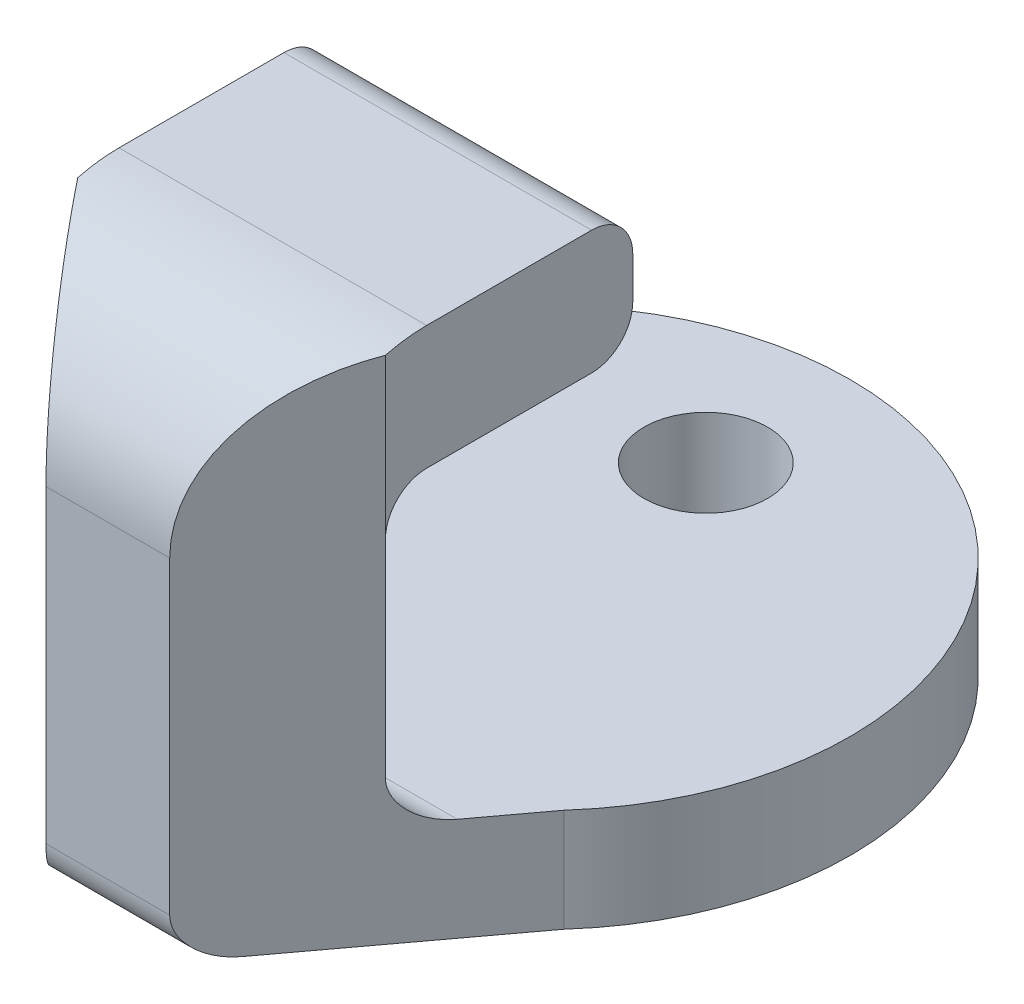
ISO-10303-21;
HEADER;
FILE_DESCRIPTION(('STEP AP214'),'2;1');
FILE_NAME('part.step','',(''),(''),'','','');
FILE_SCHEMA(('AUTOMOTIVE_DESIGN { 1 0 10303 214 1 1 1 1 }'));
ENDSEC;
DATA;
#1=APPLICATION_CONTEXT('core data for automotive mechanical design processes');
#2=APPLICATION_PROTOCOL_DEFINITION('international standard','automotive_design',2000,#1);
#3=PRODUCT_CONTEXT('',#1,'mechanical');
#4=PRODUCT('Part','Part','',(#3));
#5=PRODUCT_RELATED_PRODUCT_CATEGORY('part','',(#4));
#6=PRODUCT_DEFINITION_FORMATION('','',#4);
#7=PRODUCT_DEFINITION_CONTEXT('part definition',#1,'design');
#8=PRODUCT_DEFINITION('design','',#6,#7);
#9=PRODUCT_DEFINITION_SHAPE('','',#8);
#10=(LENGTH_UNIT() NAMED_UNIT(*) SI_UNIT(.MILLI.,.METRE.));
#11=(NAMED_UNIT(*) PLANE_ANGLE_UNIT() SI_UNIT($,.RADIAN.));
#12=(NAMED_UNIT(*) SI_UNIT($,.STERADIAN.) SOLID_ANGLE_UNIT());
#13=UNCERTAINTY_MEASURE_WITH_UNIT(LENGTH_MEASURE(1.E-05),#10,'distance_accuracy_value','');
#14=(GEOMETRIC_REPRESENTATION_CONTEXT(3) GLOBAL_UNCERTAINTY_ASSIGNED_CONTEXT((#13)) GLOBAL_UNIT_ASSIGNED_CONTEXT((#10,
#11,#12)) REPRESENTATION_CONTEXT('',''));
#15=CARTESIAN_POINT('',(0.,0.,0.));
#16=DIRECTION('',(0.,0.,1.));
#17=DIRECTION('',(1.,0.,0.));
#18=AXIS2_PLACEMENT_3D('',#15,#16,#17);
#19=CARTESIAN_POINT('',(0.,25.,15.));
#20=DIRECTION('',(0.,0.,-1.));
#21=DIRECTION('',(-1.,0.,0.));
#22=AXIS2_PLACEMENT_3D('',#19,#20,#21);
#23=PLANE('',#22);
#24=DIRECTION('',(0.,-1.,0.));
#25=VECTOR('',#24,1.);
#26=CARTESIAN_POINT('',(-7.45994938268299,25.,15.));
#27=LINE('',#26,#25);
#28=CARTESIAN_POINT('',(-7.45994938268299,17.,15.));
#29=VERTEX_POINT('',#28);
#30=CARTESIAN_POINT('',(-7.45994938268299,7.,15.));
#31=VERTEX_POINT('',#30);
#32=EDGE_CURVE('E287',#29,#31,#27,.T.);
#33=ORIENTED_EDGE('',*,*,#32,.F.);
#34=DIRECTION('',(-1.,0.,0.));
#35=VECTOR('',#34,1.);
#36=CARTESIAN_POINT('',(0.,17.,15.));
#37=LINE('',#36,#35);
#38=CARTESIAN_POINT('',(7.45994938268299,17.,15.));
#39=VERTEX_POINT('',#38);
#40=EDGE_CURVE('E284',#29,#39,#37,.F.);
#41=ORIENTED_EDGE('',*,*,#40,.T.);
#42=DIRECTION('',(0.,-1.,0.));
#43=VECTOR('',#42,1.);
#44=CARTESIAN_POINT('',(7.45994938268299,25.,15.));
#45=LINE('',#44,#43);
#46=CARTESIAN_POINT('',(7.45994938268299,7.,15.));
#47=VERTEX_POINT('',#46);
#48=EDGE_CURVE('E267',#39,#47,#45,.T.);
#49=ORIENTED_EDGE('',*,*,#48,.T.);
#50=DIRECTION('',(1.,0.,0.));
#51=VECTOR('',#50,1.);
#52=CARTESIAN_POINT('',(-7.45994938268299,7.,15.));
#53=LINE('',#52,#51);
#54=EDGE_CURVE('E274',#47,#31,#53,.F.);
#55=ORIENTED_EDGE('',*,*,#54,.T.);
#56=EDGE_LOOP('',(#33,#41,#49,#55));
#57=FACE_BOUND('',#56,.T.);
#58=ADVANCED_FACE('F35',(#57),#23,.T.);
#59=CARTESIAN_POINT('',(0.,5.,0.));
#60=DIRECTION('',(0.,1.,0.));
#61=DIRECTION('',(0.,0.,1.));
#62=AXIS2_PLACEMENT_3D('',#59,#60,#61);
#63=PLANE('',#62);
#64=CARTESIAN_POINT('',(0.,5.,-8.));
#65=DIRECTION('',(0.,1.,0.));
#66=DIRECTION('',(0.,0.,1.));
#67=AXIS2_PLACEMENT_3D('',#64,#65,#66);
#68=CIRCLE('',#67,3.);
#69=CARTESIAN_POINT('',(0.,5.,-5.));
#70=VERTEX_POINT('',#69);
#71=EDGE_CURVE('E180',#70,#70,#68,.T.);
#72=ORIENTED_EDGE('',*,*,#71,.F.);
#73=EDGE_LOOP('',(#72));
#74=FACE_BOUND('',#73,.T.);
#75=DIRECTION('',(0.596565882941631,0.,0.802564107912927));
#76=VECTOR('',#75,1.);
#77=CARTESIAN_POINT('',(-11.9867571206713,5.,8.9100550034515));
#78=LINE('',#77,#76);
#79=CARTESIAN_POINT('',(-11.1582876337844,5.,10.0246005946239));
#80=VERTEX_POINT('',#79);
#81=CARTESIAN_POINT('',(-8.94659917691066,5.,13.));
#82=VERTEX_POINT('',#81);
#83=EDGE_CURVE('E162',#80,#82,#78,.T.);
#84=ORIENTED_EDGE('',*,*,#83,.T.);
#85=DIRECTION('',(1.,0.,0.));
#86=VECTOR('',#85,1.);
#87=CARTESIAN_POINT('',(7.459949382683,5.,13.));
#88=LINE('',#87,#86);
#89=CARTESIAN_POINT('',(8.94659917691066,5.,13.));
#90=VERTEX_POINT('',#89);
#91=EDGE_CURVE('E149',#82,#90,#88,.T.);
#92=ORIENTED_EDGE('',*,*,#91,.T.);
#93=DIRECTION('',(0.596565882941631,0.,-0.802564107912927));
#94=VECTOR('',#93,1.);
#95=CARTESIAN_POINT('',(11.9867571206713,5.,8.9100550034515));
#96=LINE('',#95,#94);
#97=CARTESIAN_POINT('',(11.1582876337844,5.,10.0246005946239));
#98=VERTEX_POINT('',#97);
#99=EDGE_CURVE('E142',#90,#98,#96,.T.);
#100=ORIENTED_EDGE('',*,*,#99,.T.);
#101=CARTESIAN_POINT('',(0.,5.,0.));
#102=DIRECTION('',(0.,1.,0.));
#103=DIRECTION('',(0.,0.,1.));
#104=AXIS2_PLACEMENT_3D('',#101,#102,#103);
#105=CIRCLE('',#104,15.);
#106=EDGE_CURVE('E146',#98,#80,#105,.T.);
#107=ORIENTED_EDGE('',*,*,#106,.T.);
#108=EDGE_LOOP('',(#84,#92,#100,#107));
#109=FACE_BOUND('',#108,.T.);
#110=ADVANCED_FACE('F145',(#74,#109),#63,.T.);
#111=CARTESIAN_POINT('',(11.9867571206713,5.,8.9100550034515));
#112=DIRECTION('',(-0.802564107912927,0.,-0.596565882941631));
#113=DIRECTION('',(-0.596565882941631,0.,0.802564107912927));
#114=AXIS2_PLACEMENT_3D('',#111,#112,#113);
#115=PLANE('',#114);
#116=DIRECTION('',(0.,-1.,0.));
#117=VECTOR('',#116,1.);
#118=CARTESIAN_POINT('',(3.,5.,21.));
#119=LINE('',#118,#117);
#120=CARTESIAN_POINT('',(3.,17.,21.));
#121=VERTEX_POINT('',#120);
#122=CARTESIAN_POINT('',(3.,2.,21.));
#123=VERTEX_POINT('',#122);
#124=EDGE_CURVE('E188',#121,#123,#119,.T.);
#125=ORIENTED_EDGE('',*,*,#124,.T.);
#126=CARTESIAN_POINT('',(4.48664979422767,2.,19.));
#127=DIRECTION('',(-0.802564107912927,0.,-0.596565882941631));
#128=DIRECTION('',(0.596565882941631,0.,-0.802564107912927));
#129=AXIS2_PLACEMENT_3D('',#126,#127,#128);
#130=ELLIPSE('',#129,2.49201276294428,2.);
#131=CARTESIAN_POINT('',(4.48664979422766,0.,19.));
#132=VERTEX_POINT('',#131);
#133=EDGE_CURVE('E215',#123,#132,#130,.F.);
#134=ORIENTED_EDGE('',*,*,#133,.T.);
#135=DIRECTION('',(0.596565882941631,0.,-0.802564107912927));
#136=VECTOR('',#135,1.);
#137=CARTESIAN_POINT('',(11.9867571206713,0.,8.9100550034515));
#138=LINE('',#137,#136);
#139=CARTESIAN_POINT('',(11.1582876337844,0.,10.0246005946239));
#140=VERTEX_POINT('',#139);
#141=EDGE_CURVE('E167',#132,#140,#138,.T.);
#142=ORIENTED_EDGE('',*,*,#141,.T.);
#143=DIRECTION('',(0.,-1.,0.));
#144=VECTOR('',#143,1.);
#145=CARTESIAN_POINT('',(11.1582876337844,5.,10.0246005946239));
#146=LINE('',#145,#144);
#147=EDGE_CURVE('E158',#98,#140,#146,.T.);
#148=ORIENTED_EDGE('',*,*,#147,.F.);
#149=ORIENTED_EDGE('',*,*,#99,.F.);
#150=CARTESIAN_POINT('',(8.94659917691066,7.,13.));
#151=DIRECTION('',(-0.802564107912927,0.,-0.596565882941631));
#152=DIRECTION('',(-0.596565882941631,0.,0.802564107912927));
#153=AXIS2_PLACEMENT_3D('',#150,#151,#152);
#154=ELLIPSE('',#153,2.49201276294428,2.);
#155=EDGE_CURVE('E277',#90,#47,#154,.T.);
#156=ORIENTED_EDGE('',*,*,#155,.T.);
#157=ORIENTED_EDGE('',*,*,#48,.F.);
#158=CARTESIAN_POINT('',(7.45994938268299,24.7459666924148,15.));
#159=VERTEX_POINT('',#158);
#160=EDGE_CURVE('E286',#159,#39,#45,.T.);
#161=ORIENTED_EDGE('',*,*,#160,.F.);
#162=CARTESIAN_POINT('',(8.94659917691066,17.,13.));
#163=DIRECTION('',(-0.802564107912927,0.,-0.596565882941631));
#164=DIRECTION('',(-0.596565882941631,0.,0.802564107912927));
#165=AXIS2_PLACEMENT_3D('',#162,#163,#164);
#166=ELLIPSE('',#165,9.9680510517771,8.);
#167=EDGE_CURVE('E297',#159,#121,#166,.F.);
#168=ORIENTED_EDGE('',*,*,#167,.T.);
#169=EDGE_LOOP('',(#125,#134,#142,#148,#149,#156,#157,#161,#168));
#170=FACE_BOUND('',#169,.T.);
#171=ADVANCED_FACE('F165',(#170),#115,.F.);
#172=CARTESIAN_POINT('',(0.,5.,0.));
#173=DIRECTION('',(0.,-1.,0.));
#174=DIRECTION('',(0.,0.,-1.));
#175=AXIS2_PLACEMENT_3D('',#172,#173,#174);
#176=CYLINDRICAL_SURFACE('',#175,15.);
#177=CARTESIAN_POINT('',(0.,0.,0.));
#178=DIRECTION('',(0.,1.,0.));
#179=DIRECTION('',(0.,0.,1.));
#180=AXIS2_PLACEMENT_3D('',#177,#178,#179);
#181=CIRCLE('',#180,15.);
#182=CARTESIAN_POINT('',(-11.1582876337844,0.,10.0246005946239));
#183=VERTEX_POINT('',#182);
#184=EDGE_CURVE('E190',#140,#183,#181,.T.);
#185=ORIENTED_EDGE('',*,*,#184,.T.);
#186=DIRECTION('',(0.,-1.,0.));
#187=VECTOR('',#186,1.);
#188=CARTESIAN_POINT('',(-11.1582876337844,5.,10.0246005946239));
#189=LINE('',#188,#187);
#190=EDGE_CURVE('E160',#80,#183,#189,.T.);
#191=ORIENTED_EDGE('',*,*,#190,.F.);
#192=ORIENTED_EDGE('',*,*,#106,.F.);
#193=ORIENTED_EDGE('',*,*,#147,.T.);
#194=EDGE_LOOP('',(#185,#191,#192,#193));
#195=FACE_BOUND('',#194,.T.);
#196=ADVANCED_FACE('F157',(#195),#176,.T.);
#197=CARTESIAN_POINT('',(-11.9867571206713,5.,8.9100550034515));
#198=DIRECTION('',(0.802564107912927,0.,-0.596565882941631));
#199=DIRECTION('',(-0.596565882941631,0.,-0.802564107912927));
#200=AXIS2_PLACEMENT_3D('',#197,#198,#199);
#201=PLANE('',#200);
#202=DIRECTION('',(0.596565882941631,0.,0.802564107912927));
#203=VECTOR('',#202,1.);
#204=CARTESIAN_POINT('',(-11.9867571206713,0.,8.9100550034515));
#205=LINE('',#204,#203);
#206=CARTESIAN_POINT('',(-4.48664979422766,0.,19.));
#207=VERTEX_POINT('',#206);
#208=EDGE_CURVE('E193',#183,#207,#205,.T.);
#209=ORIENTED_EDGE('',*,*,#208,.T.);
#210=CARTESIAN_POINT('',(-4.48664979422766,2.,19.));
#211=DIRECTION('',(0.802564107912927,0.,-0.596565882941631));
#212=DIRECTION('',(0.596565882941631,0.,0.802564107912927));
#213=AXIS2_PLACEMENT_3D('',#210,#211,#212);
#214=ELLIPSE('',#213,2.49201276294427,2.);
#215=CARTESIAN_POINT('',(-3.,2.,21.));
#216=VERTEX_POINT('',#215);
#217=EDGE_CURVE('E214',#207,#216,#214,.F.);
#218=ORIENTED_EDGE('',*,*,#217,.T.);
#219=DIRECTION('',(0.,-1.,0.));
#220=VECTOR('',#219,1.);
#221=CARTESIAN_POINT('',(-3.,5.,21.));
#222=LINE('',#221,#220);
#223=CARTESIAN_POINT('',(-3.,17.,21.));
#224=VERTEX_POINT('',#223);
#225=EDGE_CURVE('E174',#224,#216,#222,.T.);
#226=ORIENTED_EDGE('',*,*,#225,.F.);
#227=CARTESIAN_POINT('',(-8.94659917691066,17.,13.));
#228=DIRECTION('',(0.802564107912927,0.,-0.596565882941631));
#229=DIRECTION('',(-0.596565882941631,0.,-0.802564107912927));
#230=AXIS2_PLACEMENT_3D('',#227,#228,#229);
#231=ELLIPSE('',#230,9.9680510517771,8.);
#232=CARTESIAN_POINT('',(-7.45994938268299,24.7459666924148,15.));
#233=VERTEX_POINT('',#232);
#234=EDGE_CURVE('E295',#224,#233,#231,.F.);
#235=ORIENTED_EDGE('',*,*,#234,.T.);
#236=EDGE_CURVE('E191',#233,#29,#27,.T.);
#237=ORIENTED_EDGE('',*,*,#236,.T.);
#238=ORIENTED_EDGE('',*,*,#32,.T.);
#239=CARTESIAN_POINT('',(-8.94659917691066,7.,13.));
#240=DIRECTION('',(0.802564107912927,0.,-0.596565882941631));
#241=DIRECTION('',(-0.596565882941631,0.,-0.802564107912927));
#242=AXIS2_PLACEMENT_3D('',#239,#240,#241);
#243=ELLIPSE('',#242,2.49201276294427,2.);
#244=EDGE_CURVE('E279',#31,#82,#243,.T.);
#245=ORIENTED_EDGE('',*,*,#244,.T.);
#246=ORIENTED_EDGE('',*,*,#83,.F.);
#247=ORIENTED_EDGE('',*,*,#190,.T.);
#248=EDGE_LOOP('',(#209,#218,#226,#235,#237,#238,#245,#246,#247));
#249=FACE_BOUND('',#248,.T.);
#250=ADVANCED_FACE('F343',(#249),#201,.F.);
#251=CARTESIAN_POINT('',(0.,5.,21.));
#252=DIRECTION('',(0.,0.,-1.));
#253=DIRECTION('',(-1.,0.,0.));
#254=AXIS2_PLACEMENT_3D('',#251,#252,#253);
#255=PLANE('',#254);
#256=ORIENTED_EDGE('',*,*,#225,.T.);
#257=DIRECTION('',(1.,0.,0.));
#258=VECTOR('',#257,1.);
#259=CARTESIAN_POINT('',(0.,2.,21.));
#260=LINE('',#259,#258);
#261=EDGE_CURVE('E205',#216,#123,#260,.T.);
#262=ORIENTED_EDGE('',*,*,#261,.T.);
#263=ORIENTED_EDGE('',*,*,#124,.F.);
#264=DIRECTION('',(1.,0.,0.));
#265=VECTOR('',#264,1.);
#266=CARTESIAN_POINT('',(-3.,17.,21.));
#267=LINE('',#266,#265);
#268=EDGE_CURVE('E207',#121,#224,#267,.F.);
#269=ORIENTED_EDGE('',*,*,#268,.T.);
#270=EDGE_LOOP('',(#256,#262,#263,#269));
#271=FACE_BOUND('',#270,.T.);
#272=ADVANCED_FACE('F203',(#271),#255,.F.);
#273=CARTESIAN_POINT('',(0.,5.,-8.));
#274=DIRECTION('',(0.,-1.,0.));
#275=DIRECTION('',(0.,0.,-1.));
#276=AXIS2_PLACEMENT_3D('',#273,#274,#275);
#277=CYLINDRICAL_SURFACE('',#276,3.);
#278=ORIENTED_EDGE('',*,*,#71,.T.);
#279=EDGE_LOOP('',(#278));
#280=FACE_BOUND('',#279,.T.);
#281=CARTESIAN_POINT('',(0.,0.,-8.));
#282=DIRECTION('',(0.,1.,0.));
#283=DIRECTION('',(0.,0.,1.));
#284=AXIS2_PLACEMENT_3D('',#281,#282,#283);
#285=CIRCLE('',#284,3.);
#286=CARTESIAN_POINT('',(0.,0.,-5.));
#287=VERTEX_POINT('',#286);
#288=EDGE_CURVE('E153',#287,#287,#285,.T.);
#289=ORIENTED_EDGE('',*,*,#288,.F.);
#290=EDGE_LOOP('',(#289));
#291=FACE_BOUND('',#290,.T.);
#292=ADVANCED_FACE('F336',(#280,#291),#277,.F.);
#293=CARTESIAN_POINT('',(0.,0.,0.));
#294=DIRECTION('',(0.,1.,0.));
#295=DIRECTION('',(0.,0.,1.));
#296=AXIS2_PLACEMENT_3D('',#293,#294,#295);
#297=PLANE('',#296);
#298=ORIENTED_EDGE('',*,*,#141,.F.);
#299=DIRECTION('',(1.,0.,0.));
#300=VECTOR('',#299,1.);
#301=CARTESIAN_POINT('',(0.,0.,19.));
#302=LINE('',#301,#300);
#303=EDGE_CURVE('E218',#132,#207,#302,.F.);
#304=ORIENTED_EDGE('',*,*,#303,.T.);
#305=ORIENTED_EDGE('',*,*,#208,.F.);
#306=ORIENTED_EDGE('',*,*,#184,.F.);
#307=EDGE_LOOP('',(#298,#304,#305,#306));
#308=FACE_BOUND('',#307,.T.);
#309=ORIENTED_EDGE('',*,*,#288,.T.);
#310=EDGE_LOOP('',(#309));
#311=FACE_BOUND('',#310,.T.);
#312=ADVANCED_FACE('F333',(#308,#311),#297,.F.);
#313=CARTESIAN_POINT('',(0.,25.,0.));
#314=DIRECTION('',(0.,1.,0.));
#315=DIRECTION('',(0.,0.,1.));
#316=AXIS2_PLACEMENT_3D('',#313,#314,#315);
#317=PLANE('',#316);
#318=DIRECTION('',(0.,0.,1.));
#319=VECTOR('',#318,1.);
#320=CARTESIAN_POINT('',(7.45994938268299,25.,2.99999999999999));
#321=LINE('',#320,#319);
#322=CARTESIAN_POINT('',(7.45994938268299,25.,4.99999999999999));
#323=VERTEX_POINT('',#322);
#324=CARTESIAN_POINT('',(7.45994938268299,25.,13.));
#325=VERTEX_POINT('',#324);
#326=EDGE_CURVE('E251',#323,#325,#321,.T.);
#327=ORIENTED_EDGE('',*,*,#326,.F.);
#328=DIRECTION('',(1.,0.,0.));
#329=VECTOR('',#328,1.);
#330=CARTESIAN_POINT('',(0.,25.,5.));
#331=LINE('',#330,#329);
#332=CARTESIAN_POINT('',(-7.459949382683,25.,5.));
#333=VERTEX_POINT('',#332);
#334=EDGE_CURVE('E58',#323,#333,#331,.F.);
#335=ORIENTED_EDGE('',*,*,#334,.T.);
#336=DIRECTION('',(0.,0.,1.));
#337=VECTOR('',#336,1.);
#338=CARTESIAN_POINT('',(-7.459949382683,25.,3.));
#339=LINE('',#338,#337);
#340=CARTESIAN_POINT('',(-7.45994938268299,25.,13.));
#341=VERTEX_POINT('',#340);
#342=EDGE_CURVE('E243',#333,#341,#339,.T.);
#343=ORIENTED_EDGE('',*,*,#342,.T.);
#344=DIRECTION('',(1.,0.,0.));
#345=VECTOR('',#344,1.);
#346=CARTESIAN_POINT('',(3.,25.,13.));
#347=LINE('',#346,#345);
#348=EDGE_CURVE('E169',#341,#325,#347,.T.);
#349=ORIENTED_EDGE('',*,*,#348,.T.);
#350=EDGE_LOOP('',(#327,#335,#343,#349));
#351=FACE_BOUND('',#350,.T.);
#352=ADVANCED_FACE('F258',(#351),#317,.T.);
#353=CARTESIAN_POINT('',(7.45994938268299,25.,2.99999999999999));
#354=DIRECTION('',(-1.,0.,0.));
#355=DIRECTION('',(0.,0.,1.));
#356=AXIS2_PLACEMENT_3D('',#353,#354,#355);
#357=PLANE('',#356);
#358=DIRECTION('',(0.,-1.,0.));
#359=VECTOR('',#358,1.);
#360=CARTESIAN_POINT('',(7.45994938268299,25.,2.99999999999999));
#361=LINE('',#360,#359);
#362=CARTESIAN_POINT('',(7.45994938268299,23.,2.99999999999999));
#363=VERTEX_POINT('',#362);
#364=CARTESIAN_POINT('',(7.45994938268299,21.,2.99999999999999));
#365=VERTEX_POINT('',#364);
#366=EDGE_CURVE('E252',#363,#365,#361,.T.);
#367=ORIENTED_EDGE('',*,*,#366,.F.);
#368=CARTESIAN_POINT('',(7.45994938268299,23.,4.99999999999999));
#369=DIRECTION('',(-1.,0.,0.));
#370=DIRECTION('',(0.,0.,1.));
#371=AXIS2_PLACEMENT_3D('',#368,#369,#370);
#372=CIRCLE('',#371,2.);
#373=EDGE_CURVE('E235',#363,#323,#372,.F.);
#374=ORIENTED_EDGE('',*,*,#373,.T.);
#375=ORIENTED_EDGE('',*,*,#326,.T.);
#376=CARTESIAN_POINT('',(7.45994938268299,17.,13.));
#377=DIRECTION('',(-1.,0.,0.));
#378=DIRECTION('',(0.,0.,1.));
#379=AXIS2_PLACEMENT_3D('',#376,#377,#378);
#380=CIRCLE('',#379,8.);
#381=EDGE_CURVE('E172',#325,#159,#380,.F.);
#382=ORIENTED_EDGE('',*,*,#381,.T.);
#383=ORIENTED_EDGE('',*,*,#160,.T.);
#384=CARTESIAN_POINT('',(7.45994938268299,17.,13.));
#385=DIRECTION('',(-1.,0.,0.));
#386=DIRECTION('',(0.,0.,1.));
#387=AXIS2_PLACEMENT_3D('',#384,#385,#386);
#388=CIRCLE('',#387,2.);
#389=CARTESIAN_POINT('',(7.45994938268299,19.,13.));
#390=VERTEX_POINT('',#389);
#391=EDGE_CURVE('E216',#39,#390,#388,.T.);
#392=ORIENTED_EDGE('',*,*,#391,.T.);
#393=DIRECTION('',(0.,0.,1.));
#394=VECTOR('',#393,1.);
#395=CARTESIAN_POINT('',(7.45994938268299,19.,2.99999999999999));
#396=LINE('',#395,#394);
#397=CARTESIAN_POINT('',(7.45994938268299,19.,4.99999999999999));
#398=VERTEX_POINT('',#397);
#399=EDGE_CURVE('E266',#398,#390,#396,.T.);
#400=ORIENTED_EDGE('',*,*,#399,.F.);
#401=CARTESIAN_POINT('',(7.45994938268299,21.,4.99999999999999));
#402=DIRECTION('',(-1.,0.,0.));
#403=DIRECTION('',(0.,0.,1.));
#404=AXIS2_PLACEMENT_3D('',#401,#402,#403);
#405=CIRCLE('',#404,2.);
#406=EDGE_CURVE('E233',#398,#365,#405,.F.);
#407=ORIENTED_EDGE('',*,*,#406,.T.);
#408=EDGE_LOOP('',(#367,#374,#375,#382,#383,#392,#400,#407));
#409=FACE_BOUND('',#408,.T.);
#410=ADVANCED_FACE('F256',(#409),#357,.F.);
#411=CARTESIAN_POINT('',(7.45994938268299,19.,2.99999999999999));
#412=DIRECTION('',(0.,1.,0.));
#413=DIRECTION('',(0.,0.,1.));
#414=AXIS2_PLACEMENT_3D('',#411,#412,#413);
#415=PLANE('',#414);
#416=DIRECTION('',(0.,0.,1.));
#417=VECTOR('',#416,1.);
#418=CARTESIAN_POINT('',(-7.459949382683,19.,3.));
#419=LINE('',#418,#417);
#420=CARTESIAN_POINT('',(-7.459949382683,19.,5.));
#421=VERTEX_POINT('',#420);
#422=CARTESIAN_POINT('',(-7.45994938268299,19.,13.));
#423=VERTEX_POINT('',#422);
#424=EDGE_CURVE('E261',#421,#423,#419,.T.);
#425=ORIENTED_EDGE('',*,*,#424,.F.);
#426=DIRECTION('',(-1.,0.,0.));
#427=VECTOR('',#426,1.);
#428=CARTESIAN_POINT('',(7.45994938268299,19.,4.99999999999999));
#429=LINE('',#428,#427);
#430=EDGE_CURVE('E11',#421,#398,#429,.F.);
#431=ORIENTED_EDGE('',*,*,#430,.T.);
#432=ORIENTED_EDGE('',*,*,#399,.T.);
#433=DIRECTION('',(-1.,0.,0.));
#434=VECTOR('',#433,1.);
#435=CARTESIAN_POINT('',(7.45994938268299,19.,13.));
#436=LINE('',#435,#434);
#437=EDGE_CURVE('E281',#390,#423,#436,.T.);
#438=ORIENTED_EDGE('',*,*,#437,.T.);
#439=EDGE_LOOP('',(#425,#431,#432,#438));
#440=FACE_BOUND('',#439,.T.);
#441=ADVANCED_FACE('F315',(#440),#415,.F.);
#442=CARTESIAN_POINT('',(-7.459949382683,25.,3.));
#443=DIRECTION('',(1.,0.,0.));
#444=DIRECTION('',(0.,0.,-1.));
#445=AXIS2_PLACEMENT_3D('',#442,#443,#444);
#446=PLANE('',#445);
#447=ORIENTED_EDGE('',*,*,#342,.F.);
#448=CARTESIAN_POINT('',(-7.459949382683,23.,5.));
#449=DIRECTION('',(1.,0.,0.));
#450=DIRECTION('',(0.,0.,-1.));
#451=AXIS2_PLACEMENT_3D('',#448,#449,#450);
#452=CIRCLE('',#451,2.);
#453=CARTESIAN_POINT('',(-7.459949382683,23.,3.));
#454=VERTEX_POINT('',#453);
#455=EDGE_CURVE('E43',#333,#454,#452,.F.);
#456=ORIENTED_EDGE('',*,*,#455,.T.);
#457=DIRECTION('',(0.,1.,0.));
#458=VECTOR('',#457,1.);
#459=CARTESIAN_POINT('',(-7.459949382683,25.,3.));
#460=LINE('',#459,#458);
#461=CARTESIAN_POINT('',(-7.459949382683,21.,3.));
#462=VERTEX_POINT('',#461);
#463=EDGE_CURVE('E241',#462,#454,#460,.T.);
#464=ORIENTED_EDGE('',*,*,#463,.F.);
#465=CARTESIAN_POINT('',(-7.459949382683,21.,5.));
#466=DIRECTION('',(1.,0.,0.));
#467=DIRECTION('',(0.,0.,-1.));
#468=AXIS2_PLACEMENT_3D('',#465,#466,#467);
#469=CIRCLE('',#468,2.);
#470=EDGE_CURVE('E50',#462,#421,#469,.F.);
#471=ORIENTED_EDGE('',*,*,#470,.T.);
#472=ORIENTED_EDGE('',*,*,#424,.T.);
#473=CARTESIAN_POINT('',(-7.45994938268299,17.,13.));
#474=DIRECTION('',(1.,0.,0.));
#475=DIRECTION('',(0.,0.,-1.));
#476=AXIS2_PLACEMENT_3D('',#473,#474,#475);
#477=CIRCLE('',#476,2.);
#478=EDGE_CURVE('E221',#423,#29,#477,.T.);
#479=ORIENTED_EDGE('',*,*,#478,.T.);
#480=ORIENTED_EDGE('',*,*,#236,.F.);
#481=CARTESIAN_POINT('',(-7.45994938268299,17.,13.));
#482=DIRECTION('',(1.,0.,0.));
#483=DIRECTION('',(0.,0.,-1.));
#484=AXIS2_PLACEMENT_3D('',#481,#482,#483);
#485=CIRCLE('',#484,8.);
#486=EDGE_CURVE('E271',#233,#341,#485,.F.);
#487=ORIENTED_EDGE('',*,*,#486,.T.);
#488=EDGE_LOOP('',(#447,#456,#464,#471,#472,#479,#480,#487));
#489=FACE_BOUND('',#488,.T.);
#490=ADVANCED_FACE('F240',(#489),#446,.F.);
#491=CARTESIAN_POINT('',(0.,0.,3.));
#492=DIRECTION('',(0.,0.,-1.));
#493=DIRECTION('',(-1.,0.,0.));
#494=AXIS2_PLACEMENT_3D('',#491,#492,#493);
#495=PLANE('',#494);
#496=ORIENTED_EDGE('',*,*,#463,.T.);
#497=DIRECTION('',(1.,0.,0.));
#498=VECTOR('',#497,1.);
#499=CARTESIAN_POINT('',(0.,23.,3.));
#500=LINE('',#499,#498);
#501=EDGE_CURVE('E230',#454,#363,#500,.T.);
#502=ORIENTED_EDGE('',*,*,#501,.T.);
#503=ORIENTED_EDGE('',*,*,#366,.T.);
#504=DIRECTION('',(-1.,0.,0.));
#505=VECTOR('',#504,1.);
#506=CARTESIAN_POINT('',(-7.459949382683,21.,3.));
#507=LINE('',#506,#505);
#508=EDGE_CURVE('E227',#365,#462,#507,.T.);
#509=ORIENTED_EDGE('',*,*,#508,.T.);
#510=EDGE_LOOP('',(#496,#502,#503,#509));
#511=FACE_BOUND('',#510,.T.);
#512=ADVANCED_FACE('F247',(#511),#495,.T.);
#513=CARTESIAN_POINT('',(0.,17.,13.));
#514=DIRECTION('',(-1.,0.,0.));
#515=DIRECTION('',(0.,0.,1.));
#516=AXIS2_PLACEMENT_3D('',#513,#514,#515);
#517=CYLINDRICAL_SURFACE('',#516,8.);
#518=ORIENTED_EDGE('',*,*,#234,.F.);
#519=ORIENTED_EDGE('',*,*,#268,.F.);
#520=ORIENTED_EDGE('',*,*,#167,.F.);
#521=ORIENTED_EDGE('',*,*,#381,.F.);
#522=ORIENTED_EDGE('',*,*,#348,.F.);
#523=ORIENTED_EDGE('',*,*,#486,.F.);
#524=EDGE_LOOP('',(#518,#519,#520,#521,#522,#523));
#525=FACE_BOUND('',#524,.T.);
#526=ADVANCED_FACE('F350',(#525),#517,.T.);
#527=CARTESIAN_POINT('',(0.,7.,13.));
#528=DIRECTION('',(-1.,0.,0.));
#529=DIRECTION('',(0.,0.,1.));
#530=AXIS2_PLACEMENT_3D('',#527,#528,#529);
#531=CYLINDRICAL_SURFACE('',#530,2.);
#532=ORIENTED_EDGE('',*,*,#244,.F.);
#533=ORIENTED_EDGE('',*,*,#54,.F.);
#534=ORIENTED_EDGE('',*,*,#155,.F.);
#535=ORIENTED_EDGE('',*,*,#91,.F.);
#536=EDGE_LOOP('',(#532,#533,#534,#535));
#537=FACE_BOUND('',#536,.T.);
#538=ADVANCED_FACE('F353',(#537),#531,.F.);
#539=CARTESIAN_POINT('',(7.45994938268299,17.,13.));
#540=DIRECTION('',(-1.,0.,0.));
#541=DIRECTION('',(0.,0.,1.));
#542=AXIS2_PLACEMENT_3D('',#539,#540,#541);
#543=CYLINDRICAL_SURFACE('',#542,2.);
#544=ORIENTED_EDGE('',*,*,#391,.F.);
#545=ORIENTED_EDGE('',*,*,#40,.F.);
#546=ORIENTED_EDGE('',*,*,#478,.F.);
#547=ORIENTED_EDGE('',*,*,#437,.F.);
#548=EDGE_LOOP('',(#544,#545,#546,#547));
#549=FACE_BOUND('',#548,.T.);
#550=ADVANCED_FACE('F313',(#549),#543,.F.);
#551=CARTESIAN_POINT('',(0.,2.,19.));
#552=DIRECTION('',(1.,0.,0.));
#553=DIRECTION('',(0.,0.,-1.));
#554=AXIS2_PLACEMENT_3D('',#551,#552,#553);
#555=CYLINDRICAL_SURFACE('',#554,2.);
#556=ORIENTED_EDGE('',*,*,#217,.F.);
#557=ORIENTED_EDGE('',*,*,#303,.F.);
#558=ORIENTED_EDGE('',*,*,#133,.F.);
#559=ORIENTED_EDGE('',*,*,#261,.F.);
#560=EDGE_LOOP('',(#556,#557,#558,#559));
#561=FACE_BOUND('',#560,.T.);
#562=ADVANCED_FACE('F212',(#561),#555,.T.);
#563=CARTESIAN_POINT('',(0.,23.,5.));
#564=DIRECTION('',(1.,0.,0.));
#565=DIRECTION('',(0.,0.,-1.));
#566=AXIS2_PLACEMENT_3D('',#563,#564,#565);
#567=CYLINDRICAL_SURFACE('',#566,2.);
#568=ORIENTED_EDGE('',*,*,#455,.F.);
#569=ORIENTED_EDGE('',*,*,#334,.F.);
#570=ORIENTED_EDGE('',*,*,#373,.F.);
#571=ORIENTED_EDGE('',*,*,#501,.F.);
#572=EDGE_LOOP('',(#568,#569,#570,#571));
#573=FACE_BOUND('',#572,.T.);
#574=ADVANCED_FACE('F254',(#573),#567,.T.);
#575=CARTESIAN_POINT('',(0.,21.,5.));
#576=DIRECTION('',(1.,0.,0.));
#577=DIRECTION('',(0.,0.,-1.));
#578=AXIS2_PLACEMENT_3D('',#575,#576,#577);
#579=CYLINDRICAL_SURFACE('',#578,2.);
#580=ORIENTED_EDGE('',*,*,#406,.F.);
#581=ORIENTED_EDGE('',*,*,#430,.F.);
#582=ORIENTED_EDGE('',*,*,#470,.F.);
#583=ORIENTED_EDGE('',*,*,#508,.F.);
#584=EDGE_LOOP('',(#580,#581,#582,#583));
#585=FACE_BOUND('',#584,.T.);
#586=ADVANCED_FACE('F37',(#585),#579,.T.);
#587=CLOSED_SHELL('',(#58,#110,#171,#196,#250,#272,#292,#312,#352,#410,#441,#490,#512,#526,#538,
#550,#562,#574,#586));
#588=MANIFOLD_SOLID_BREP('B2',#587);
#589=ADVANCED_BREP_SHAPE_REPRESENTATION('',(#18,#588),#14);
#590=SHAPE_DEFINITION_REPRESENTATION(#9,#589);
ENDSEC;
END-ISO-10303-21;
